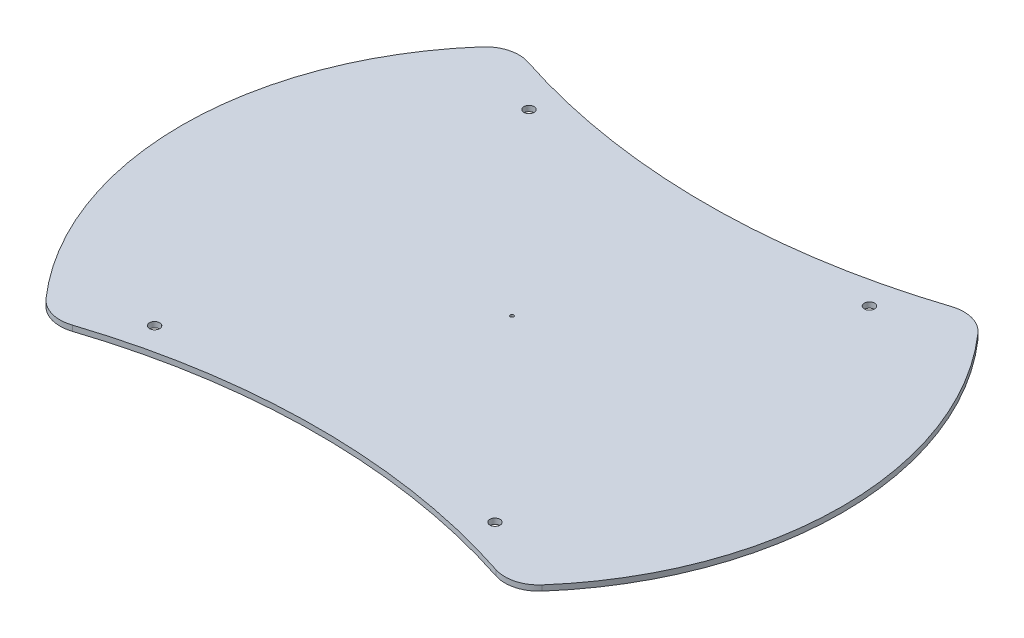
ISO-10303-21;
HEADER;
FILE_DESCRIPTION(('STEP AP214'),'2;1');
FILE_NAME('part.step','',(''),(''),'','','');
FILE_SCHEMA(('AUTOMOTIVE_DESIGN { 1 0 10303 214 1 1 1 1 }'));
ENDSEC;
DATA;
#1=APPLICATION_CONTEXT('core data for automotive mechanical design processes');
#2=APPLICATION_PROTOCOL_DEFINITION('international standard','automotive_design',2000,#1);
#3=PRODUCT_CONTEXT('',#1,'mechanical');
#4=PRODUCT('Part','Part','',(#3));
#5=PRODUCT_RELATED_PRODUCT_CATEGORY('part','',(#4));
#6=PRODUCT_DEFINITION_FORMATION('','',#4);
#7=PRODUCT_DEFINITION_CONTEXT('part definition',#1,'design');
#8=PRODUCT_DEFINITION('design','',#6,#7);
#9=PRODUCT_DEFINITION_SHAPE('','',#8);
#10=(LENGTH_UNIT() NAMED_UNIT(*) SI_UNIT(.MILLI.,.METRE.));
#11=(NAMED_UNIT(*) PLANE_ANGLE_UNIT() SI_UNIT($,.RADIAN.));
#12=(NAMED_UNIT(*) SI_UNIT($,.STERADIAN.) SOLID_ANGLE_UNIT());
#13=UNCERTAINTY_MEASURE_WITH_UNIT(LENGTH_MEASURE(1.E-05),#10,'distance_accuracy_value','');
#14=(GEOMETRIC_REPRESENTATION_CONTEXT(3) GLOBAL_UNCERTAINTY_ASSIGNED_CONTEXT((#13)) GLOBAL_UNIT_ASSIGNED_CONTEXT((#10,
#11,#12)) REPRESENTATION_CONTEXT('',''));
#15=CARTESIAN_POINT('',(0.,0.,0.));
#16=DIRECTION('',(0.,0.,1.));
#17=DIRECTION('',(1.,0.,0.));
#18=AXIS2_PLACEMENT_3D('',#15,#16,#17);
#19=CARTESIAN_POINT('',(0.,1.6,0.));
#20=DIRECTION('',(0.,1.,0.));
#21=DIRECTION('',(0.,0.,1.));
#22=AXIS2_PLACEMENT_3D('',#19,#20,#21);
#23=PLANE('',#22);
#24=CARTESIAN_POINT('',(50.,1.6,-55.));
#25=DIRECTION('',(0.,-1.,0.));
#26=DIRECTION('',(0.,0.,1.));
#27=AXIS2_PLACEMENT_3D('',#24,#25,#26);
#28=CIRCLE('',#27,1.5);
#29=CARTESIAN_POINT('',(50.,1.6,-53.5));
#30=VERTEX_POINT('',#29);
#31=EDGE_CURVE('E302',#30,#30,#28,.T.);
#32=ORIENTED_EDGE('',*,*,#31,.T.);
#33=EDGE_LOOP('',(#32));
#34=FACE_BOUND('',#33,.T.);
#35=CARTESIAN_POINT('',(-50.,1.6,-55.));
#36=DIRECTION('',(0.,1.,0.));
#37=DIRECTION('',(0.,0.,1.));
#38=AXIS2_PLACEMENT_3D('',#35,#36,#37);
#39=CIRCLE('',#38,1.5);
#40=CARTESIAN_POINT('',(-50.,1.6,-53.5));
#41=VERTEX_POINT('',#40);
#42=EDGE_CURVE('E308',#41,#41,#39,.T.);
#43=ORIENTED_EDGE('',*,*,#42,.F.);
#44=EDGE_LOOP('',(#43));
#45=FACE_BOUND('',#44,.T.);
#46=CARTESIAN_POINT('',(0.,1.6,0.));
#47=DIRECTION('',(0.,1.,0.));
#48=DIRECTION('',(0.,0.,1.));
#49=AXIS2_PLACEMENT_3D('',#46,#47,#48);
#50=CIRCLE('',#49,0.5);
#51=CARTESIAN_POINT('',(0.,1.6,0.5));
#52=VERTEX_POINT('',#51);
#53=EDGE_CURVE('E143',#52,#52,#50,.T.);
#54=ORIENTED_EDGE('',*,*,#53,.F.);
#55=EDGE_LOOP('',(#54));
#56=FACE_BOUND('',#55,.T.);
#57=CARTESIAN_POINT('',(0.,1.6,-257.));
#58=DIRECTION('',(0.,1.,0.));
#59=DIRECTION('',(0.,0.,1.));
#60=AXIS2_PLACEMENT_3D('',#57,#58,#59);
#61=CIRCLE('',#60,200.);
#62=CARTESIAN_POINT('',(-62.2410137280366,1.6,-66.9314433944784));
#63=VERTEX_POINT('',#62);
#64=CARTESIAN_POINT('',(62.2410137280365,1.6,-66.9314433944784));
#65=VERTEX_POINT('',#64);
#66=EDGE_CURVE('E148',#63,#65,#61,.T.);
#67=ORIENTED_EDGE('',*,*,#66,.F.);
#68=CARTESIAN_POINT('',(-65.3530644144384,1.6,-57.4280155642023));
#69=DIRECTION('',(0.,1.,0.));
#70=DIRECTION('',(0.,0.,1.));
#71=AXIS2_PLACEMENT_3D('',#68,#69,#70);
#72=CIRCLE('',#71,10.);
#73=CARTESIAN_POINT('',(-72.8649108988566,1.6,-64.028936893421));
#74=VERTEX_POINT('',#73);
#75=EDGE_CURVE('E162',#63,#74,#72,.T.);
#76=ORIENTED_EDGE('',*,*,#75,.T.);
#77=CARTESIAN_POINT('',(0.,1.6,0.));
#78=DIRECTION('',(0.,1.,0.));
#79=DIRECTION('',(0.,0.,1.));
#80=AXIS2_PLACEMENT_3D('',#77,#78,#79);
#81=CIRCLE('',#80,97.);
#82=CARTESIAN_POINT('',(-72.8649108988566,1.6,64.028936893421));
#83=VERTEX_POINT('',#82);
#84=EDGE_CURVE('E124',#74,#83,#81,.T.);
#85=ORIENTED_EDGE('',*,*,#84,.T.);
#86=CARTESIAN_POINT('',(-65.3530644144383,1.6,57.4280155642023));
#87=DIRECTION('',(0.,1.,0.));
#88=DIRECTION('',(0.,0.,1.));
#89=AXIS2_PLACEMENT_3D('',#86,#87,#88);
#90=CIRCLE('',#89,10.);
#91=CARTESIAN_POINT('',(-62.2410137280365,1.6,66.9314433944784));
#92=VERTEX_POINT('',#91);
#93=EDGE_CURVE('E157',#83,#92,#90,.T.);
#94=ORIENTED_EDGE('',*,*,#93,.T.);
#95=CARTESIAN_POINT('',(0.,1.6,257.));
#96=DIRECTION('',(0.,1.,0.));
#97=DIRECTION('',(0.,0.,1.));
#98=AXIS2_PLACEMENT_3D('',#95,#96,#97);
#99=CIRCLE('',#98,200.);
#100=CARTESIAN_POINT('',(62.2410137280366,1.6,66.9314433944784));
#101=VERTEX_POINT('',#100);
#102=EDGE_CURVE('E172',#92,#101,#99,.F.);
#103=ORIENTED_EDGE('',*,*,#102,.T.);
#104=CARTESIAN_POINT('',(65.3530644144384,1.6,57.4280155642023));
#105=DIRECTION('',(0.,1.,0.));
#106=DIRECTION('',(0.,0.,1.));
#107=AXIS2_PLACEMENT_3D('',#104,#105,#106);
#108=CIRCLE('',#107,10.);
#109=CARTESIAN_POINT('',(72.8649108988566,1.6,64.028936893421));
#110=VERTEX_POINT('',#109);
#111=EDGE_CURVE('E60',#101,#110,#108,.T.);
#112=ORIENTED_EDGE('',*,*,#111,.T.);
#113=CARTESIAN_POINT('',(72.8649108988566,1.6,-64.028936893421));
#114=VERTEX_POINT('',#113);
#115=EDGE_CURVE('E179',#110,#114,#81,.T.);
#116=ORIENTED_EDGE('',*,*,#115,.T.);
#117=CARTESIAN_POINT('',(65.3530644144383,1.6,-57.4280155642023));
#118=DIRECTION('',(0.,1.,0.));
#119=DIRECTION('',(0.,0.,1.));
#120=AXIS2_PLACEMENT_3D('',#117,#118,#119);
#121=CIRCLE('',#120,10.);
#122=EDGE_CURVE('E160',#114,#65,#121,.T.);
#123=ORIENTED_EDGE('',*,*,#122,.T.);
#124=EDGE_LOOP('',(#67,#76,#85,#94,#103,#112,#116,#123));
#125=FACE_BOUND('',#124,.T.);
#126=CARTESIAN_POINT('',(50.,1.6,55.));
#127=DIRECTION('',(0.,1.,0.));
#128=DIRECTION('',(0.,0.,-1.));
#129=AXIS2_PLACEMENT_3D('',#126,#127,#128);
#130=CIRCLE('',#129,1.5);
#131=CARTESIAN_POINT('',(50.,1.6,53.5));
#132=VERTEX_POINT('',#131);
#133=EDGE_CURVE('E296',#132,#132,#130,.T.);
#134=ORIENTED_EDGE('',*,*,#133,.F.);
#135=EDGE_LOOP('',(#134));
#136=FACE_BOUND('',#135,.T.);
#137=CARTESIAN_POINT('',(-50.,1.6,55.));
#138=DIRECTION('',(0.,-1.,0.));
#139=DIRECTION('',(0.,0.,-1.));
#140=AXIS2_PLACEMENT_3D('',#137,#138,#139);
#141=CIRCLE('',#140,1.5);
#142=CARTESIAN_POINT('',(-50.,1.6,53.5));
#143=VERTEX_POINT('',#142);
#144=EDGE_CURVE('E293',#143,#143,#141,.T.);
#145=ORIENTED_EDGE('',*,*,#144,.T.);
#146=EDGE_LOOP('',(#145));
#147=FACE_BOUND('',#146,.T.);
#148=ADVANCED_FACE('F38',(#34,#45,#56,#125,#136,#147),#23,.T.);
#149=CARTESIAN_POINT('',(0.,0.,0.));
#150=DIRECTION('',(0.,1.,0.));
#151=DIRECTION('',(0.,0.,1.));
#152=AXIS2_PLACEMENT_3D('',#149,#150,#151);
#153=PLANE('',#152);
#154=CARTESIAN_POINT('',(50.,0.,-55.));
#155=DIRECTION('',(0.,-1.,0.));
#156=DIRECTION('',(0.,0.,1.));
#157=AXIS2_PLACEMENT_3D('',#154,#155,#156);
#158=CIRCLE('',#157,1.5);
#159=CARTESIAN_POINT('',(50.,0.,-53.5));
#160=VERTEX_POINT('',#159);
#161=EDGE_CURVE('E305',#160,#160,#158,.T.);
#162=ORIENTED_EDGE('',*,*,#161,.F.);
#163=EDGE_LOOP('',(#162));
#164=FACE_BOUND('',#163,.T.);
#165=CARTESIAN_POINT('',(-50.,0.,-55.));
#166=DIRECTION('',(0.,1.,0.));
#167=DIRECTION('',(0.,0.,1.));
#168=AXIS2_PLACEMENT_3D('',#165,#166,#167);
#169=CIRCLE('',#168,1.5);
#170=CARTESIAN_POINT('',(-50.,0.,-53.5));
#171=VERTEX_POINT('',#170);
#172=EDGE_CURVE('E138',#171,#171,#169,.T.);
#173=ORIENTED_EDGE('',*,*,#172,.T.);
#174=EDGE_LOOP('',(#173));
#175=FACE_BOUND('',#174,.T.);
#176=CARTESIAN_POINT('',(0.,0.,0.));
#177=DIRECTION('',(0.,1.,0.));
#178=DIRECTION('',(0.,0.,1.));
#179=AXIS2_PLACEMENT_3D('',#176,#177,#178);
#180=CIRCLE('',#179,0.5);
#181=CARTESIAN_POINT('',(0.,0.,0.5));
#182=VERTEX_POINT('',#181);
#183=EDGE_CURVE('E132',#182,#182,#180,.T.);
#184=ORIENTED_EDGE('',*,*,#183,.T.);
#185=EDGE_LOOP('',(#184));
#186=FACE_BOUND('',#185,.T.);
#187=CARTESIAN_POINT('',(0.,0.,0.));
#188=DIRECTION('',(0.,1.,0.));
#189=DIRECTION('',(0.,0.,1.));
#190=AXIS2_PLACEMENT_3D('',#187,#188,#189);
#191=CIRCLE('',#190,97.);
#192=CARTESIAN_POINT('',(-72.8649108988566,0.,-64.028936893421));
#193=VERTEX_POINT('',#192);
#194=CARTESIAN_POINT('',(-72.8649108988566,0.,64.028936893421));
#195=VERTEX_POINT('',#194);
#196=EDGE_CURVE('E121',#193,#195,#191,.T.);
#197=ORIENTED_EDGE('',*,*,#196,.F.);
#198=CARTESIAN_POINT('',(-65.3530644144384,0.,-57.4280155642023));
#199=DIRECTION('',(0.,1.,0.));
#200=DIRECTION('',(0.,0.,1.));
#201=AXIS2_PLACEMENT_3D('',#198,#199,#200);
#202=CIRCLE('',#201,10.);
#203=CARTESIAN_POINT('',(-62.2410137280366,0.,-66.9314433944784));
#204=VERTEX_POINT('',#203);
#205=EDGE_CURVE('E104',#193,#204,#202,.F.);
#206=ORIENTED_EDGE('',*,*,#205,.T.);
#207=CARTESIAN_POINT('',(0.,0.,-257.));
#208=DIRECTION('',(0.,1.,0.));
#209=DIRECTION('',(0.,0.,1.));
#210=AXIS2_PLACEMENT_3D('',#207,#208,#209);
#211=CIRCLE('',#210,200.);
#212=CARTESIAN_POINT('',(62.2410137280365,0.,-66.9314433944784));
#213=VERTEX_POINT('',#212);
#214=EDGE_CURVE('E140',#204,#213,#211,.T.);
#215=ORIENTED_EDGE('',*,*,#214,.T.);
#216=CARTESIAN_POINT('',(65.3530644144383,0.,-57.4280155642023));
#217=DIRECTION('',(0.,1.,0.));
#218=DIRECTION('',(0.,0.,1.));
#219=AXIS2_PLACEMENT_3D('',#216,#217,#218);
#220=CIRCLE('',#219,10.);
#221=CARTESIAN_POINT('',(72.8649108988566,0.,-64.028936893421));
#222=VERTEX_POINT('',#221);
#223=EDGE_CURVE('E115',#213,#222,#220,.F.);
#224=ORIENTED_EDGE('',*,*,#223,.T.);
#225=CARTESIAN_POINT('',(72.8649108988566,0.,64.028936893421));
#226=VERTEX_POINT('',#225);
#227=EDGE_CURVE('E134',#226,#222,#191,.T.);
#228=ORIENTED_EDGE('',*,*,#227,.F.);
#229=CARTESIAN_POINT('',(65.3530644144384,0.,57.4280155642023));
#230=DIRECTION('',(0.,1.,0.));
#231=DIRECTION('',(0.,0.,1.));
#232=AXIS2_PLACEMENT_3D('',#229,#230,#231);
#233=CIRCLE('',#232,10.);
#234=CARTESIAN_POINT('',(62.2410137280366,0.,66.9314433944784));
#235=VERTEX_POINT('',#234);
#236=EDGE_CURVE('E151',#226,#235,#233,.F.);
#237=ORIENTED_EDGE('',*,*,#236,.T.);
#238=CARTESIAN_POINT('',(0.,0.,257.));
#239=DIRECTION('',(0.,1.,0.));
#240=DIRECTION('',(0.,0.,1.));
#241=AXIS2_PLACEMENT_3D('',#238,#239,#240);
#242=CIRCLE('',#241,200.);
#243=CARTESIAN_POINT('',(-62.2410137280365,0.,66.9314433944784));
#244=VERTEX_POINT('',#243);
#245=EDGE_CURVE('E131',#244,#235,#242,.F.);
#246=ORIENTED_EDGE('',*,*,#245,.F.);
#247=CARTESIAN_POINT('',(-65.3530644144383,0.,57.4280155642023));
#248=DIRECTION('',(0.,1.,0.));
#249=DIRECTION('',(0.,0.,1.));
#250=AXIS2_PLACEMENT_3D('',#247,#248,#249);
#251=CIRCLE('',#250,10.);
#252=EDGE_CURVE('E125',#244,#195,#251,.F.);
#253=ORIENTED_EDGE('',*,*,#252,.T.);
#254=EDGE_LOOP('',(#197,#206,#215,#224,#228,#237,#246,#253));
#255=FACE_BOUND('',#254,.T.);
#256=CARTESIAN_POINT('',(50.,0.,55.));
#257=DIRECTION('',(0.,1.,0.));
#258=DIRECTION('',(0.,0.,-1.));
#259=AXIS2_PLACEMENT_3D('',#256,#257,#258);
#260=CIRCLE('',#259,1.5);
#261=CARTESIAN_POINT('',(50.,0.,53.5));
#262=VERTEX_POINT('',#261);
#263=EDGE_CURVE('E299',#262,#262,#260,.T.);
#264=ORIENTED_EDGE('',*,*,#263,.T.);
#265=EDGE_LOOP('',(#264));
#266=FACE_BOUND('',#265,.T.);
#267=CARTESIAN_POINT('',(-50.,0.,55.));
#268=DIRECTION('',(0.,-1.,0.));
#269=DIRECTION('',(0.,0.,-1.));
#270=AXIS2_PLACEMENT_3D('',#267,#268,#269);
#271=CIRCLE('',#270,1.5);
#272=CARTESIAN_POINT('',(-50.,0.,53.5));
#273=VERTEX_POINT('',#272);
#274=EDGE_CURVE('E290',#273,#273,#271,.T.);
#275=ORIENTED_EDGE('',*,*,#274,.F.);
#276=EDGE_LOOP('',(#275));
#277=FACE_BOUND('',#276,.T.);
#278=ADVANCED_FACE('F128',(#164,#175,#186,#255,#266,#277),#153,.F.);
#279=CARTESIAN_POINT('',(0.,1.6,0.));
#280=DIRECTION('',(0.,-1.,0.));
#281=DIRECTION('',(0.,0.,-1.));
#282=AXIS2_PLACEMENT_3D('',#279,#280,#281);
#283=CYLINDRICAL_SURFACE('',#282,97.);
#284=ORIENTED_EDGE('',*,*,#84,.F.);
#285=DIRECTION('',(0.,-1.,0.));
#286=VECTOR('',#285,1.);
#287=CARTESIAN_POINT('',(-72.8649108988566,1.6,-64.028936893421));
#288=LINE('',#287,#286);
#289=EDGE_CURVE('E108',#74,#193,#288,.T.);
#290=ORIENTED_EDGE('',*,*,#289,.T.);
#291=ORIENTED_EDGE('',*,*,#196,.T.);
#292=DIRECTION('',(0.,-1.,0.));
#293=VECTOR('',#292,1.);
#294=CARTESIAN_POINT('',(-72.8649108988566,1.6,64.028936893421));
#295=LINE('',#294,#293);
#296=EDGE_CURVE('E126',#195,#83,#295,.F.);
#297=ORIENTED_EDGE('',*,*,#296,.T.);
#298=EDGE_LOOP('',(#284,#290,#291,#297));
#299=FACE_BOUND('',#298,.T.);
#300=ADVANCED_FACE('F120',(#299),#283,.T.);
#301=CARTESIAN_POINT('',(0.,1.6,257.));
#302=DIRECTION('',(0.,-1.,0.));
#303=DIRECTION('',(0.,0.,-1.));
#304=AXIS2_PLACEMENT_3D('',#301,#302,#303);
#305=CYLINDRICAL_SURFACE('',#304,200.);
#306=ORIENTED_EDGE('',*,*,#245,.T.);
#307=DIRECTION('',(0.,-1.,0.));
#308=VECTOR('',#307,1.);
#309=CARTESIAN_POINT('',(62.2410137280366,1.6,66.9314433944784));
#310=LINE('',#309,#308);
#311=EDGE_CURVE('E11',#235,#101,#310,.F.);
#312=ORIENTED_EDGE('',*,*,#311,.T.);
#313=ORIENTED_EDGE('',*,*,#102,.F.);
#314=DIRECTION('',(0.,-1.,0.));
#315=VECTOR('',#314,1.);
#316=CARTESIAN_POINT('',(-62.2410137280365,1.6,66.9314433944784));
#317=LINE('',#316,#315);
#318=EDGE_CURVE('E46',#92,#244,#317,.T.);
#319=ORIENTED_EDGE('',*,*,#318,.T.);
#320=EDGE_LOOP('',(#306,#312,#313,#319));
#321=FACE_BOUND('',#320,.T.);
#322=ADVANCED_FACE('F170',(#321),#305,.F.);
#323=ORIENTED_EDGE('',*,*,#227,.T.);
#324=DIRECTION('',(0.,-1.,0.));
#325=VECTOR('',#324,1.);
#326=CARTESIAN_POINT('',(72.8649108988566,1.6,-64.028936893421));
#327=LINE('',#326,#325);
#328=EDGE_CURVE('E53',#222,#114,#327,.F.);
#329=ORIENTED_EDGE('',*,*,#328,.T.);
#330=ORIENTED_EDGE('',*,*,#115,.F.);
#331=DIRECTION('',(0.,-1.,0.));
#332=VECTOR('',#331,1.);
#333=CARTESIAN_POINT('',(72.8649108988566,1.6,64.028936893421));
#334=LINE('',#333,#332);
#335=EDGE_CURVE('E164',#110,#226,#334,.T.);
#336=ORIENTED_EDGE('',*,*,#335,.T.);
#337=EDGE_LOOP('',(#323,#329,#330,#336));
#338=FACE_BOUND('',#337,.T.);
#339=ADVANCED_FACE('F178',(#338),#283,.T.);
#340=CARTESIAN_POINT('',(0.,1.6,0.));
#341=DIRECTION('',(0.,-1.,0.));
#342=DIRECTION('',(0.,0.,-1.));
#343=AXIS2_PLACEMENT_3D('',#340,#341,#342);
#344=CYLINDRICAL_SURFACE('',#343,0.5);
#345=ORIENTED_EDGE('',*,*,#53,.T.);
#346=EDGE_LOOP('',(#345));
#347=FACE_BOUND('',#346,.T.);
#348=ORIENTED_EDGE('',*,*,#183,.F.);
#349=EDGE_LOOP('',(#348));
#350=FACE_BOUND('',#349,.T.);
#351=ADVANCED_FACE('F212',(#347,#350),#344,.F.);
#352=CARTESIAN_POINT('',(0.,1.6,-257.));
#353=DIRECTION('',(0.,-1.,0.));
#354=DIRECTION('',(0.,0.,-1.));
#355=AXIS2_PLACEMENT_3D('',#352,#353,#354);
#356=CYLINDRICAL_SURFACE('',#355,200.);
#357=ORIENTED_EDGE('',*,*,#214,.F.);
#358=DIRECTION('',(0.,-1.,0.));
#359=VECTOR('',#358,1.);
#360=CARTESIAN_POINT('',(-62.2410137280366,1.6,-66.9314433944784));
#361=LINE('',#360,#359);
#362=EDGE_CURVE('E109',#204,#63,#361,.F.);
#363=ORIENTED_EDGE('',*,*,#362,.T.);
#364=ORIENTED_EDGE('',*,*,#66,.T.);
#365=DIRECTION('',(0.,-1.,0.));
#366=VECTOR('',#365,1.);
#367=CARTESIAN_POINT('',(62.2410137280365,1.6,-66.9314433944784));
#368=LINE('',#367,#366);
#369=EDGE_CURVE('E114',#65,#213,#368,.T.);
#370=ORIENTED_EDGE('',*,*,#369,.T.);
#371=EDGE_LOOP('',(#357,#363,#364,#370));
#372=FACE_BOUND('',#371,.T.);
#373=ADVANCED_FACE('F209',(#372),#356,.F.);
#374=CARTESIAN_POINT('',(-65.3530644144384,1.6,-57.4280155642023));
#375=DIRECTION('',(0.,1.,0.));
#376=DIRECTION('',(0.,0.,1.));
#377=AXIS2_PLACEMENT_3D('',#374,#375,#376);
#378=CYLINDRICAL_SURFACE('',#377,10.);
#379=ORIENTED_EDGE('',*,*,#75,.F.);
#380=ORIENTED_EDGE('',*,*,#362,.F.);
#381=ORIENTED_EDGE('',*,*,#205,.F.);
#382=ORIENTED_EDGE('',*,*,#289,.F.);
#383=EDGE_LOOP('',(#379,#380,#381,#382));
#384=FACE_BOUND('',#383,.T.);
#385=ADVANCED_FACE('F107',(#384),#378,.T.);
#386=CARTESIAN_POINT('',(65.3530644144383,1.6,-57.4280155642023));
#387=DIRECTION('',(0.,1.,0.));
#388=DIRECTION('',(0.,0.,1.));
#389=AXIS2_PLACEMENT_3D('',#386,#387,#388);
#390=CYLINDRICAL_SURFACE('',#389,10.);
#391=ORIENTED_EDGE('',*,*,#122,.F.);
#392=ORIENTED_EDGE('',*,*,#328,.F.);
#393=ORIENTED_EDGE('',*,*,#223,.F.);
#394=ORIENTED_EDGE('',*,*,#369,.F.);
#395=EDGE_LOOP('',(#391,#392,#393,#394));
#396=FACE_BOUND('',#395,.T.);
#397=ADVANCED_FACE('F196',(#396),#390,.T.);
#398=CARTESIAN_POINT('',(65.3530644144384,1.6,57.4280155642023));
#399=DIRECTION('',(0.,1.,0.));
#400=DIRECTION('',(0.,0.,1.));
#401=AXIS2_PLACEMENT_3D('',#398,#399,#400);
#402=CYLINDRICAL_SURFACE('',#401,10.);
#403=ORIENTED_EDGE('',*,*,#111,.F.);
#404=ORIENTED_EDGE('',*,*,#311,.F.);
#405=ORIENTED_EDGE('',*,*,#236,.F.);
#406=ORIENTED_EDGE('',*,*,#335,.F.);
#407=EDGE_LOOP('',(#403,#404,#405,#406));
#408=FACE_BOUND('',#407,.T.);
#409=ADVANCED_FACE('F177',(#408),#402,.T.);
#410=CARTESIAN_POINT('',(-65.3530644144383,1.6,57.4280155642023));
#411=DIRECTION('',(0.,1.,0.));
#412=DIRECTION('',(0.,0.,1.));
#413=AXIS2_PLACEMENT_3D('',#410,#411,#412);
#414=CYLINDRICAL_SURFACE('',#413,10.);
#415=ORIENTED_EDGE('',*,*,#93,.F.);
#416=ORIENTED_EDGE('',*,*,#296,.F.);
#417=ORIENTED_EDGE('',*,*,#252,.F.);
#418=ORIENTED_EDGE('',*,*,#318,.F.);
#419=EDGE_LOOP('',(#415,#416,#417,#418));
#420=FACE_BOUND('',#419,.T.);
#421=ADVANCED_FACE('F40',(#420),#414,.T.);
#422=CARTESIAN_POINT('',(-50.,0.,-55.));
#423=DIRECTION('',(0.,1.,0.));
#424=DIRECTION('',(0.,0.,1.));
#425=AXIS2_PLACEMENT_3D('',#422,#423,#424);
#426=CYLINDRICAL_SURFACE('',#425,1.5);
#427=ORIENTED_EDGE('',*,*,#172,.F.);
#428=EDGE_LOOP('',(#427));
#429=FACE_BOUND('',#428,.T.);
#430=ORIENTED_EDGE('',*,*,#42,.T.);
#431=EDGE_LOOP('',(#430));
#432=FACE_BOUND('',#431,.T.);
#433=ADVANCED_FACE('F188',(#429,#432),#426,.F.);
#434=CARTESIAN_POINT('',(50.,0.,-55.));
#435=DIRECTION('',(0.,1.,0.));
#436=DIRECTION('',(0.,0.,1.));
#437=AXIS2_PLACEMENT_3D('',#434,#435,#436);
#438=CYLINDRICAL_SURFACE('',#437,1.5);
#439=ORIENTED_EDGE('',*,*,#161,.T.);
#440=EDGE_LOOP('',(#439));
#441=FACE_BOUND('',#440,.T.);
#442=ORIENTED_EDGE('',*,*,#31,.F.);
#443=EDGE_LOOP('',(#442));
#444=FACE_BOUND('',#443,.T.);
#445=ADVANCED_FACE('F193',(#441,#444),#438,.F.);
#446=CARTESIAN_POINT('',(50.,0.,55.));
#447=DIRECTION('',(0.,1.,0.));
#448=DIRECTION('',(0.,0.,1.));
#449=AXIS2_PLACEMENT_3D('',#446,#447,#448);
#450=CYLINDRICAL_SURFACE('',#449,1.5);
#451=ORIENTED_EDGE('',*,*,#263,.F.);
#452=EDGE_LOOP('',(#451));
#453=FACE_BOUND('',#452,.T.);
#454=ORIENTED_EDGE('',*,*,#133,.T.);
#455=EDGE_LOOP('',(#454));
#456=FACE_BOUND('',#455,.T.);
#457=ADVANCED_FACE('F252',(#453,#456),#450,.F.);
#458=CARTESIAN_POINT('',(-50.,0.,55.));
#459=DIRECTION('',(0.,1.,0.));
#460=DIRECTION('',(0.,0.,1.));
#461=AXIS2_PLACEMENT_3D('',#458,#459,#460);
#462=CYLINDRICAL_SURFACE('',#461,1.5);
#463=ORIENTED_EDGE('',*,*,#274,.T.);
#464=EDGE_LOOP('',(#463));
#465=FACE_BOUND('',#464,.T.);
#466=ORIENTED_EDGE('',*,*,#144,.F.);
#467=EDGE_LOOP('',(#466));
#468=FACE_BOUND('',#467,.T.);
#469=ADVANCED_FACE('F273',(#465,#468),#462,.F.);
#470=CLOSED_SHELL('',(#148,#278,#300,#322,#339,#351,#373,#385,#397,#409,#421,#433,#445,#457,#469));
#471=MANIFOLD_SOLID_BREP('B2',#470);
#472=ADVANCED_BREP_SHAPE_REPRESENTATION('',(#18,#471),#14);
#473=SHAPE_DEFINITION_REPRESENTATION(#9,#472);
ENDSEC;
END-ISO-10303-21;
